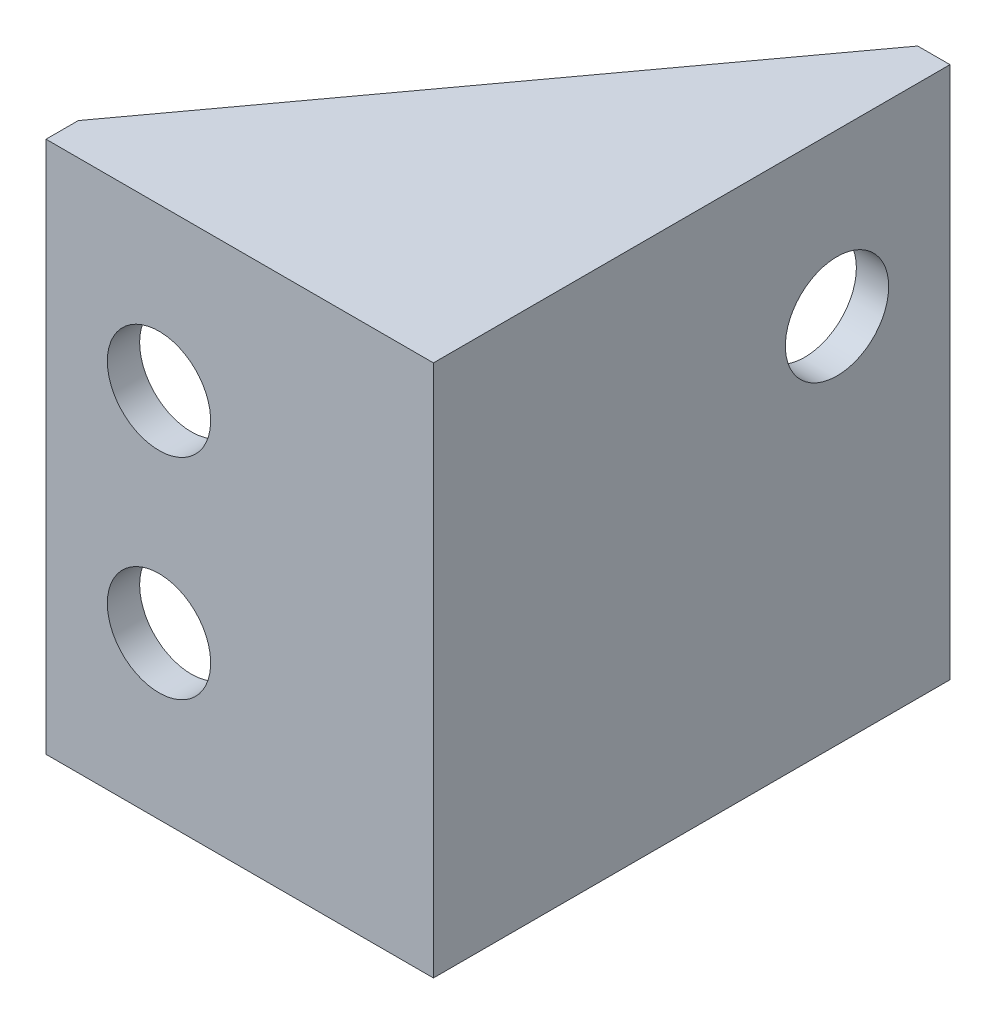
ISO-10303-21;
HEADER;
FILE_DESCRIPTION(('STEP AP214'),'2;1');
FILE_NAME('part.step','',(''),(''),'','','');
FILE_SCHEMA(('AUTOMOTIVE_DESIGN { 1 0 10303 214 1 1 1 1 }'));
ENDSEC;
DATA;
#1=APPLICATION_CONTEXT('core data for automotive mechanical design processes');
#2=APPLICATION_PROTOCOL_DEFINITION('international standard','automotive_design',2000,#1);
#3=PRODUCT_CONTEXT('',#1,'mechanical');
#4=PRODUCT('Part','Part','',(#3));
#5=PRODUCT_RELATED_PRODUCT_CATEGORY('part','',(#4));
#6=PRODUCT_DEFINITION_FORMATION('','',#4);
#7=PRODUCT_DEFINITION_CONTEXT('part definition',#1,'design');
#8=PRODUCT_DEFINITION('design','',#6,#7);
#9=PRODUCT_DEFINITION_SHAPE('','',#8);
#10=(LENGTH_UNIT() NAMED_UNIT(*) SI_UNIT(.MILLI.,.METRE.));
#11=(NAMED_UNIT(*) PLANE_ANGLE_UNIT() SI_UNIT($,.RADIAN.));
#12=(NAMED_UNIT(*) SI_UNIT($,.STERADIAN.) SOLID_ANGLE_UNIT());
#13=UNCERTAINTY_MEASURE_WITH_UNIT(LENGTH_MEASURE(1.E-05),#10,'distance_accuracy_value','');
#14=(GEOMETRIC_REPRESENTATION_CONTEXT(3) GLOBAL_UNCERTAINTY_ASSIGNED_CONTEXT((#13)) GLOBAL_UNIT_ASSIGNED_CONTEXT((#10,
#11,#12)) REPRESENTATION_CONTEXT('',''));
#15=CARTESIAN_POINT('',(0.,0.,0.));
#16=DIRECTION('',(0.,0.,1.));
#17=DIRECTION('',(1.,0.,0.));
#18=AXIS2_PLACEMENT_3D('',#15,#16,#17);
#19=CARTESIAN_POINT('',(11.,16.5,-16.));
#20=DIRECTION('',(1.,0.,0.));
#21=DIRECTION('',(0.,0.,-1.));
#22=AXIS2_PLACEMENT_3D('',#19,#20,#21);
#23=PLANE('',#22);
#24=CARTESIAN_POINT('',(11.,11.5,-12.5));
#25=DIRECTION('',(1.,0.,0.));
#26=DIRECTION('',(0.,0.,-1.));
#27=AXIS2_PLACEMENT_3D('',#24,#25,#26);
#28=CIRCLE('',#27,1.6);
#29=CARTESIAN_POINT('',(11.,11.5,-14.1));
#30=VERTEX_POINT('',#29);
#31=EDGE_CURVE('E37',#30,#30,#28,.T.);
#32=ORIENTED_EDGE('',*,*,#31,.T.);
#33=EDGE_LOOP('',(#32));
#34=FACE_BOUND('',#33,.T.);
#35=DIRECTION('',(0.,0.,-1.));
#36=VECTOR('',#35,1.);
#37=CARTESIAN_POINT('',(11.,15.5,-1.));
#38=LINE('',#37,#36);
#39=CARTESIAN_POINT('',(11.,15.5,-1.));
#40=VERTEX_POINT('',#39);
#41=CARTESIAN_POINT('',(11.,15.5,-16.));
#42=VERTEX_POINT('',#41);
#43=EDGE_CURVE('E105',#40,#42,#38,.T.);
#44=ORIENTED_EDGE('',*,*,#43,.T.);
#45=DIRECTION('',(0.,-1.,0.));
#46=VECTOR('',#45,1.);
#47=CARTESIAN_POINT('',(11.,16.5,-16.));
#48=LINE('',#47,#46);
#49=CARTESIAN_POINT('',(11.,1.,-16.));
#50=VERTEX_POINT('',#49);
#51=EDGE_CURVE('E49',#42,#50,#48,.T.);
#52=ORIENTED_EDGE('',*,*,#51,.T.);
#53=DIRECTION('',(0.,0.,1.));
#54=VECTOR('',#53,1.);
#55=CARTESIAN_POINT('',(11.,1.,-1.));
#56=LINE('',#55,#54);
#57=CARTESIAN_POINT('',(11.,1.,-1.));
#58=VERTEX_POINT('',#57);
#59=EDGE_CURVE('E189',#50,#58,#56,.T.);
#60=ORIENTED_EDGE('',*,*,#59,.T.);
#61=DIRECTION('',(0.,-1.,0.));
#62=VECTOR('',#61,1.);
#63=CARTESIAN_POINT('',(11.,16.5,-1.));
#64=LINE('',#63,#62);
#65=EDGE_CURVE('E57',#40,#58,#64,.T.);
#66=ORIENTED_EDGE('',*,*,#65,.F.);
#67=EDGE_LOOP('',(#44,#52,#60,#66));
#68=FACE_BOUND('',#67,.T.);
#69=ADVANCED_FACE('F33',(#34,#68),#23,.F.);
#70=CARTESIAN_POINT('',(11.,16.5,-1.));
#71=DIRECTION('',(0.,0.,1.));
#72=DIRECTION('',(1.,0.,0.));
#73=AXIS2_PLACEMENT_3D('',#70,#71,#72);
#74=PLANE('',#73);
#75=CARTESIAN_POINT('',(3.5,11.5,-1.));
#76=DIRECTION('',(0.,0.,-1.));
#77=DIRECTION('',(-1.,0.,0.));
#78=AXIS2_PLACEMENT_3D('',#75,#76,#77);
#79=CIRCLE('',#78,1.6);
#80=CARTESIAN_POINT('',(1.9,11.5,-1.));
#81=VERTEX_POINT('',#80);
#82=EDGE_CURVE('E175',#81,#81,#79,.T.);
#83=ORIENTED_EDGE('',*,*,#82,.F.);
#84=EDGE_LOOP('',(#83));
#85=FACE_BOUND('',#84,.T.);
#86=CARTESIAN_POINT('',(3.5,5.,-1.));
#87=DIRECTION('',(0.,0.,-1.));
#88=DIRECTION('',(-1.,0.,0.));
#89=AXIS2_PLACEMENT_3D('',#86,#87,#88);
#90=CIRCLE('',#89,1.6);
#91=CARTESIAN_POINT('',(1.9,5.,-1.));
#92=VERTEX_POINT('',#91);
#93=EDGE_CURVE('E174',#92,#92,#90,.T.);
#94=ORIENTED_EDGE('',*,*,#93,.F.);
#95=EDGE_LOOP('',(#94));
#96=FACE_BOUND('',#95,.T.);
#97=DIRECTION('',(1.,0.,0.));
#98=VECTOR('',#97,1.);
#99=CARTESIAN_POINT('',(0.,15.5,-1.));
#100=LINE('',#99,#98);
#101=CARTESIAN_POINT('',(0.,15.5,-1.));
#102=VERTEX_POINT('',#101);
#103=EDGE_CURVE('E101',#102,#40,#100,.T.);
#104=ORIENTED_EDGE('',*,*,#103,.T.);
#105=ORIENTED_EDGE('',*,*,#65,.T.);
#106=DIRECTION('',(-1.,0.,0.));
#107=VECTOR('',#106,1.);
#108=CARTESIAN_POINT('',(0.,1.,-1.));
#109=LINE('',#108,#107);
#110=CARTESIAN_POINT('',(0.,1.,-1.));
#111=VERTEX_POINT('',#110);
#112=EDGE_CURVE('E121',#58,#111,#109,.T.);
#113=ORIENTED_EDGE('',*,*,#112,.T.);
#114=DIRECTION('',(0.,-1.,0.));
#115=VECTOR('',#114,1.);
#116=CARTESIAN_POINT('',(0.,16.5,-1.));
#117=LINE('',#116,#115);
#118=EDGE_CURVE('E118',#102,#111,#117,.T.);
#119=ORIENTED_EDGE('',*,*,#118,.F.);
#120=EDGE_LOOP('',(#104,#105,#113,#119));
#121=FACE_BOUND('',#120,.T.);
#122=ADVANCED_FACE('F119',(#85,#96,#121),#74,.F.);
#123=CARTESIAN_POINT('',(0.,16.5,-1.));
#124=DIRECTION('',(1.,0.,0.));
#125=DIRECTION('',(0.,0.,-1.));
#126=AXIS2_PLACEMENT_3D('',#123,#124,#125);
#127=PLANE('',#126);
#128=DIRECTION('',(0.,0.,1.));
#129=VECTOR('',#128,1.);
#130=CARTESIAN_POINT('',(0.,0.,-1.));
#131=LINE('',#130,#129);
#132=CARTESIAN_POINT('',(0.,0.,-1.));
#133=VERTEX_POINT('',#132);
#134=CARTESIAN_POINT('',(0.,0.,0.));
#135=VERTEX_POINT('',#134);
#136=EDGE_CURVE('E155',#133,#135,#131,.T.);
#137=ORIENTED_EDGE('',*,*,#136,.T.);
#138=DIRECTION('',(0.,-1.,0.));
#139=VECTOR('',#138,1.);
#140=CARTESIAN_POINT('',(0.,16.5,0.));
#141=LINE('',#140,#139);
#142=CARTESIAN_POINT('',(0.,16.5,0.));
#143=VERTEX_POINT('',#142);
#144=EDGE_CURVE('E11',#143,#135,#141,.T.);
#145=ORIENTED_EDGE('',*,*,#144,.F.);
#146=DIRECTION('',(0.,0.,1.));
#147=VECTOR('',#146,1.);
#148=CARTESIAN_POINT('',(0.,16.5,-1.));
#149=LINE('',#148,#147);
#150=CARTESIAN_POINT('',(0.,16.5,-1.));
#151=VERTEX_POINT('',#150);
#152=EDGE_CURVE('E129',#151,#143,#149,.T.);
#153=ORIENTED_EDGE('',*,*,#152,.F.);
#154=EDGE_CURVE('E112',#151,#102,#117,.T.);
#155=ORIENTED_EDGE('',*,*,#154,.T.);
#156=ORIENTED_EDGE('',*,*,#118,.T.);
#157=DIRECTION('',(0.,-1.,0.));
#158=VECTOR('',#157,1.);
#159=CARTESIAN_POINT('',(0.,1.,-1.));
#160=LINE('',#159,#158);
#161=EDGE_CURVE('E178',#111,#133,#160,.T.);
#162=ORIENTED_EDGE('',*,*,#161,.T.);
#163=EDGE_LOOP('',(#137,#145,#153,#155,#156,#162));
#164=FACE_BOUND('',#163,.T.);
#165=ADVANCED_FACE('F35',(#164),#127,.F.);
#166=CARTESIAN_POINT('',(0.,16.5,0.));
#167=DIRECTION('',(0.,0.,-1.));
#168=DIRECTION('',(-1.,0.,0.));
#169=AXIS2_PLACEMENT_3D('',#166,#167,#168);
#170=PLANE('',#169);
#171=CARTESIAN_POINT('',(3.5,5.,0.));
#172=DIRECTION('',(0.,0.,-1.));
#173=DIRECTION('',(-1.,0.,0.));
#174=AXIS2_PLACEMENT_3D('',#171,#172,#173);
#175=CIRCLE('',#174,1.6);
#176=CARTESIAN_POINT('',(1.9,5.,0.));
#177=VERTEX_POINT('',#176);
#178=EDGE_CURVE('E168',#177,#177,#175,.T.);
#179=ORIENTED_EDGE('',*,*,#178,.T.);
#180=EDGE_LOOP('',(#179));
#181=FACE_BOUND('',#180,.T.);
#182=CARTESIAN_POINT('',(3.5,11.5,0.));
#183=DIRECTION('',(0.,0.,-1.));
#184=DIRECTION('',(-1.,0.,0.));
#185=AXIS2_PLACEMENT_3D('',#182,#183,#184);
#186=CIRCLE('',#185,1.6);
#187=CARTESIAN_POINT('',(1.9,11.5,0.));
#188=VERTEX_POINT('',#187);
#189=EDGE_CURVE('E171',#188,#188,#186,.T.);
#190=ORIENTED_EDGE('',*,*,#189,.T.);
#191=EDGE_LOOP('',(#190));
#192=FACE_BOUND('',#191,.T.);
#193=DIRECTION('',(1.,0.,0.));
#194=VECTOR('',#193,1.);
#195=CARTESIAN_POINT('',(0.,0.,0.));
#196=LINE('',#195,#194);
#197=CARTESIAN_POINT('',(12.,0.,0.));
#198=VERTEX_POINT('',#197);
#199=EDGE_CURVE('E153',#135,#198,#196,.T.);
#200=ORIENTED_EDGE('',*,*,#199,.T.);
#201=DIRECTION('',(0.,-1.,0.));
#202=VECTOR('',#201,1.);
#203=CARTESIAN_POINT('',(12.,16.5,0.));
#204=LINE('',#203,#202);
#205=CARTESIAN_POINT('',(12.,16.5,0.));
#206=VERTEX_POINT('',#205);
#207=EDGE_CURVE('E42',#206,#198,#204,.T.);
#208=ORIENTED_EDGE('',*,*,#207,.F.);
#209=DIRECTION('',(1.,0.,0.));
#210=VECTOR('',#209,1.);
#211=CARTESIAN_POINT('',(0.,16.5,0.));
#212=LINE('',#211,#210);
#213=EDGE_CURVE('E162',#143,#206,#212,.T.);
#214=ORIENTED_EDGE('',*,*,#213,.F.);
#215=ORIENTED_EDGE('',*,*,#144,.T.);
#216=EDGE_LOOP('',(#200,#208,#214,#215));
#217=FACE_BOUND('',#216,.T.);
#218=ADVANCED_FACE('F204',(#181,#192,#217),#170,.F.);
#219=CARTESIAN_POINT('',(12.,16.5,0.));
#220=DIRECTION('',(-1.,0.,0.));
#221=DIRECTION('',(0.,0.,1.));
#222=AXIS2_PLACEMENT_3D('',#219,#220,#221);
#223=PLANE('',#222);
#224=CARTESIAN_POINT('',(12.,11.5,-12.5));
#225=DIRECTION('',(1.,0.,0.));
#226=DIRECTION('',(0.,0.,-1.));
#227=AXIS2_PLACEMENT_3D('',#224,#225,#226);
#228=CIRCLE('',#227,1.6);
#229=CARTESIAN_POINT('',(12.,11.5,-14.1));
#230=VERTEX_POINT('',#229);
#231=EDGE_CURVE('E165',#230,#230,#228,.T.);
#232=ORIENTED_EDGE('',*,*,#231,.F.);
#233=EDGE_LOOP('',(#232));
#234=FACE_BOUND('',#233,.T.);
#235=DIRECTION('',(0.,0.,-1.));
#236=VECTOR('',#235,1.);
#237=CARTESIAN_POINT('',(12.,0.,0.));
#238=LINE('',#237,#236);
#239=CARTESIAN_POINT('',(12.,0.,-16.));
#240=VERTEX_POINT('',#239);
#241=EDGE_CURVE('E146',#198,#240,#238,.T.);
#242=ORIENTED_EDGE('',*,*,#241,.T.);
#243=DIRECTION('',(0.,-1.,0.));
#244=VECTOR('',#243,1.);
#245=CARTESIAN_POINT('',(12.,16.5,-16.));
#246=LINE('',#245,#244);
#247=CARTESIAN_POINT('',(12.,16.5,-16.));
#248=VERTEX_POINT('',#247);
#249=EDGE_CURVE('E136',#248,#240,#246,.T.);
#250=ORIENTED_EDGE('',*,*,#249,.F.);
#251=DIRECTION('',(0.,0.,-1.));
#252=VECTOR('',#251,1.);
#253=CARTESIAN_POINT('',(12.,16.5,0.));
#254=LINE('',#253,#252);
#255=EDGE_CURVE('E147',#206,#248,#254,.T.);
#256=ORIENTED_EDGE('',*,*,#255,.F.);
#257=ORIENTED_EDGE('',*,*,#207,.T.);
#258=EDGE_LOOP('',(#242,#250,#256,#257));
#259=FACE_BOUND('',#258,.T.);
#260=ADVANCED_FACE('F144',(#234,#259),#223,.F.);
#261=CARTESIAN_POINT('',(12.,16.5,-16.));
#262=DIRECTION('',(0.,0.,1.));
#263=DIRECTION('',(1.,0.,0.));
#264=AXIS2_PLACEMENT_3D('',#261,#262,#263);
#265=PLANE('',#264);
#266=DIRECTION('',(-1.,0.,0.));
#267=VECTOR('',#266,1.);
#268=CARTESIAN_POINT('',(12.,0.,-16.));
#269=LINE('',#268,#267);
#270=CARTESIAN_POINT('',(11.,0.,-16.));
#271=VERTEX_POINT('',#270);
#272=EDGE_CURVE('E132',#240,#271,#269,.T.);
#273=ORIENTED_EDGE('',*,*,#272,.T.);
#274=DIRECTION('',(0.,-1.,0.));
#275=VECTOR('',#274,1.);
#276=CARTESIAN_POINT('',(11.,1.,-16.));
#277=LINE('',#276,#275);
#278=EDGE_CURVE('E181',#50,#271,#277,.T.);
#279=ORIENTED_EDGE('',*,*,#278,.F.);
#280=ORIENTED_EDGE('',*,*,#51,.F.);
#281=CARTESIAN_POINT('',(11.,16.5,-16.));
#282=VERTEX_POINT('',#281);
#283=EDGE_CURVE('E115',#282,#42,#48,.T.);
#284=ORIENTED_EDGE('',*,*,#283,.F.);
#285=DIRECTION('',(-1.,0.,0.));
#286=VECTOR('',#285,1.);
#287=CARTESIAN_POINT('',(12.,16.5,-16.));
#288=LINE('',#287,#286);
#289=EDGE_CURVE('E124',#248,#282,#288,.T.);
#290=ORIENTED_EDGE('',*,*,#289,.F.);
#291=ORIENTED_EDGE('',*,*,#249,.T.);
#292=EDGE_LOOP('',(#273,#279,#280,#284,#290,#291));
#293=FACE_BOUND('',#292,.T.);
#294=ADVANCED_FACE('F195',(#293),#265,.F.);
#295=CARTESIAN_POINT('',(0.,16.5,0.));
#296=DIRECTION('',(0.,1.,0.));
#297=DIRECTION('',(0.,0.,1.));
#298=AXIS2_PLACEMENT_3D('',#295,#296,#297);
#299=PLANE('',#298);
#300=ORIENTED_EDGE('',*,*,#152,.T.);
#301=ORIENTED_EDGE('',*,*,#213,.T.);
#302=ORIENTED_EDGE('',*,*,#255,.T.);
#303=ORIENTED_EDGE('',*,*,#289,.T.);
#304=DIRECTION('',(-0.591363663627517,0.,0.806404995855706));
#305=VECTOR('',#304,1.);
#306=CARTESIAN_POINT('',(11.,16.5,-16.));
#307=LINE('',#306,#305);
#308=EDGE_CURVE('E116',#282,#151,#307,.T.);
#309=ORIENTED_EDGE('',*,*,#308,.T.);
#310=EDGE_LOOP('',(#300,#301,#302,#303,#309));
#311=FACE_BOUND('',#310,.T.);
#312=ADVANCED_FACE('F206',(#311),#299,.T.);
#313=CARTESIAN_POINT('',(0.,0.,0.));
#314=DIRECTION('',(0.,1.,0.));
#315=DIRECTION('',(0.,0.,1.));
#316=AXIS2_PLACEMENT_3D('',#313,#314,#315);
#317=PLANE('',#316);
#318=ORIENTED_EDGE('',*,*,#136,.F.);
#319=DIRECTION('',(0.591363663627517,0.,-0.806404995855706));
#320=VECTOR('',#319,1.);
#321=CARTESIAN_POINT('',(11.,0.,-16.));
#322=LINE('',#321,#320);
#323=EDGE_CURVE('E185',#133,#271,#322,.T.);
#324=ORIENTED_EDGE('',*,*,#323,.T.);
#325=ORIENTED_EDGE('',*,*,#272,.F.);
#326=ORIENTED_EDGE('',*,*,#241,.F.);
#327=ORIENTED_EDGE('',*,*,#199,.F.);
#328=EDGE_LOOP('',(#318,#324,#325,#326,#327));
#329=FACE_BOUND('',#328,.T.);
#330=ADVANCED_FACE('F152',(#329),#317,.F.);
#331=CARTESIAN_POINT('',(6.,11.5,-12.5));
#332=DIRECTION('',(1.,0.,0.));
#333=DIRECTION('',(0.,0.,-1.));
#334=AXIS2_PLACEMENT_3D('',#331,#332,#333);
#335=CYLINDRICAL_SURFACE('',#334,1.6);
#336=ORIENTED_EDGE('',*,*,#231,.T.);
#337=EDGE_LOOP('',(#336));
#338=FACE_BOUND('',#337,.T.);
#339=ORIENTED_EDGE('',*,*,#31,.F.);
#340=EDGE_LOOP('',(#339));
#341=FACE_BOUND('',#340,.T.);
#342=ADVANCED_FACE('F213',(#338,#341),#335,.F.);
#343=CARTESIAN_POINT('',(3.5,11.5,9.));
#344=DIRECTION('',(0.,0.,-1.));
#345=DIRECTION('',(-1.,0.,0.));
#346=AXIS2_PLACEMENT_3D('',#343,#344,#345);
#347=CYLINDRICAL_SURFACE('',#346,1.6);
#348=ORIENTED_EDGE('',*,*,#82,.T.);
#349=EDGE_LOOP('',(#348));
#350=FACE_BOUND('',#349,.T.);
#351=ORIENTED_EDGE('',*,*,#189,.F.);
#352=EDGE_LOOP('',(#351));
#353=FACE_BOUND('',#352,.T.);
#354=ADVANCED_FACE('F238',(#350,#353),#347,.F.);
#355=CARTESIAN_POINT('',(3.5,5.,9.));
#356=DIRECTION('',(0.,0.,-1.));
#357=DIRECTION('',(-1.,0.,0.));
#358=AXIS2_PLACEMENT_3D('',#355,#356,#357);
#359=CYLINDRICAL_SURFACE('',#358,1.6);
#360=ORIENTED_EDGE('',*,*,#93,.T.);
#361=EDGE_LOOP('',(#360));
#362=FACE_BOUND('',#361,.T.);
#363=ORIENTED_EDGE('',*,*,#178,.F.);
#364=EDGE_LOOP('',(#363));
#365=FACE_BOUND('',#364,.T.);
#366=ADVANCED_FACE('F240',(#362,#365),#359,.F.);
#367=CARTESIAN_POINT('',(11.,1.,-16.));
#368=DIRECTION('',(-0.806404995855706,0.,-0.591363663627517));
#369=DIRECTION('',(-0.591363663627517,0.,0.806404995855706));
#370=AXIS2_PLACEMENT_3D('',#367,#368,#369);
#371=PLANE('',#370);
#372=ORIENTED_EDGE('',*,*,#323,.F.);
#373=ORIENTED_EDGE('',*,*,#161,.F.);
#374=DIRECTION('',(0.591363663627517,0.,-0.806404995855706));
#375=VECTOR('',#374,1.);
#376=CARTESIAN_POINT('',(11.,1.,-16.));
#377=LINE('',#376,#375);
#378=EDGE_CURVE('E187',#111,#50,#377,.T.);
#379=ORIENTED_EDGE('',*,*,#378,.T.);
#380=ORIENTED_EDGE('',*,*,#278,.T.);
#381=EDGE_LOOP('',(#372,#373,#379,#380));
#382=FACE_BOUND('',#381,.T.);
#383=ADVANCED_FACE('F203',(#382),#371,.T.);
#384=CARTESIAN_POINT('',(0.,1.,0.));
#385=DIRECTION('',(0.,1.,0.));
#386=DIRECTION('',(0.,0.,1.));
#387=AXIS2_PLACEMENT_3D('',#384,#385,#386);
#388=PLANE('',#387);
#389=ORIENTED_EDGE('',*,*,#378,.F.);
#390=ORIENTED_EDGE('',*,*,#112,.F.);
#391=ORIENTED_EDGE('',*,*,#59,.F.);
#392=EDGE_LOOP('',(#389,#390,#391));
#393=FACE_BOUND('',#392,.T.);
#394=ADVANCED_FACE('F202',(#393),#388,.T.);
#395=CARTESIAN_POINT('',(11.,15.5,-16.));
#396=DIRECTION('',(-0.806404995855706,0.,-0.591363663627517));
#397=DIRECTION('',(-0.591363663627517,0.,0.806404995855706));
#398=AXIS2_PLACEMENT_3D('',#395,#396,#397);
#399=PLANE('',#398);
#400=ORIENTED_EDGE('',*,*,#308,.F.);
#401=ORIENTED_EDGE('',*,*,#283,.T.);
#402=DIRECTION('',(-0.591363663627517,0.,0.806404995855706));
#403=VECTOR('',#402,1.);
#404=CARTESIAN_POINT('',(11.,15.5,-16.));
#405=LINE('',#404,#403);
#406=EDGE_CURVE('E104',#42,#102,#405,.T.);
#407=ORIENTED_EDGE('',*,*,#406,.T.);
#408=ORIENTED_EDGE('',*,*,#154,.F.);
#409=EDGE_LOOP('',(#400,#401,#407,#408));
#410=FACE_BOUND('',#409,.T.);
#411=ADVANCED_FACE('F110',(#410),#399,.T.);
#412=CARTESIAN_POINT('',(0.,15.5,0.));
#413=DIRECTION('',(0.,1.,0.));
#414=DIRECTION('',(0.,0.,1.));
#415=AXIS2_PLACEMENT_3D('',#412,#413,#414);
#416=PLANE('',#415);
#417=ORIENTED_EDGE('',*,*,#406,.F.);
#418=ORIENTED_EDGE('',*,*,#43,.F.);
#419=ORIENTED_EDGE('',*,*,#103,.F.);
#420=EDGE_LOOP('',(#417,#418,#419));
#421=FACE_BOUND('',#420,.T.);
#422=ADVANCED_FACE('F103',(#421),#416,.F.);
#423=CLOSED_SHELL('',(#69,#122,#165,#218,#260,#294,#312,#330,#342,#354,#366,#383,#394,#411,#422));
#424=MANIFOLD_SOLID_BREP('B2',#423);
#425=ADVANCED_BREP_SHAPE_REPRESENTATION('',(#18,#424),#14);
#426=SHAPE_DEFINITION_REPRESENTATION(#9,#425);
ENDSEC;
END-ISO-10303-21;
